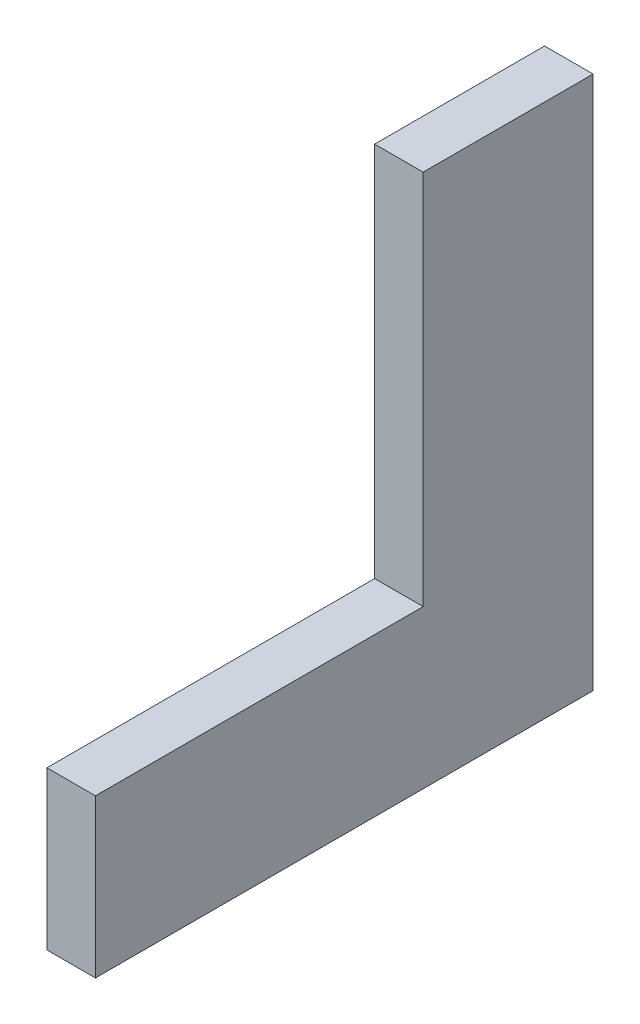
ISO-10303-21;
HEADER;
FILE_DESCRIPTION(('STEP AP214'),'2;1');
FILE_NAME('part.step','',(''),(''),'','','');
FILE_SCHEMA(('AUTOMOTIVE_DESIGN { 1 0 10303 214 1 1 1 1 }'));
ENDSEC;
DATA;
#1=APPLICATION_CONTEXT('core data for automotive mechanical design processes');
#2=APPLICATION_PROTOCOL_DEFINITION('international standard','automotive_design',2000,#1);
#3=PRODUCT_CONTEXT('',#1,'mechanical');
#4=PRODUCT('Part','Part','',(#3));
#5=PRODUCT_RELATED_PRODUCT_CATEGORY('part','',(#4));
#6=PRODUCT_DEFINITION_FORMATION('','',#4);
#7=PRODUCT_DEFINITION_CONTEXT('part definition',#1,'design');
#8=PRODUCT_DEFINITION('design','',#6,#7);
#9=PRODUCT_DEFINITION_SHAPE('','',#8);
#10=(LENGTH_UNIT() NAMED_UNIT(*) SI_UNIT(.MILLI.,.METRE.));
#11=(NAMED_UNIT(*) PLANE_ANGLE_UNIT() SI_UNIT($,.RADIAN.));
#12=(NAMED_UNIT(*) SI_UNIT($,.STERADIAN.) SOLID_ANGLE_UNIT());
#13=UNCERTAINTY_MEASURE_WITH_UNIT(LENGTH_MEASURE(1.E-05),#10,'distance_accuracy_value','');
#14=(GEOMETRIC_REPRESENTATION_CONTEXT(3) GLOBAL_UNCERTAINTY_ASSIGNED_CONTEXT((#13)) GLOBAL_UNIT_ASSIGNED_CONTEXT((#10,
#11,#12)) REPRESENTATION_CONTEXT('',''));
#15=CARTESIAN_POINT('',(0.,0.,0.));
#16=DIRECTION('',(0.,0.,1.));
#17=DIRECTION('',(1.,0.,0.));
#18=AXIS2_PLACEMENT_3D('',#15,#16,#17);
#19=CARTESIAN_POINT('',(1.42499934,-18.52500066,2.05));
#20=DIRECTION('',(-1.,0.,0.));
#21=DIRECTION('',(0.,0.,1.));
#22=AXIS2_PLACEMENT_3D('',#19,#20,#21);
#23=PLANE('',#22);
#24=DIRECTION('',(0.,0.,1.));
#25=VECTOR('',#24,1.);
#26=CARTESIAN_POINT('',(1.42499934,-16.32500066,2.05));
#27=LINE('',#26,#25);
#28=CARTESIAN_POINT('',(1.42499934,-16.32500066,0.7));
#29=VERTEX_POINT('',#28);
#30=CARTESIAN_POINT('',(1.42499934,-16.32500066,0.));
#31=VERTEX_POINT('',#30);
#32=EDGE_CURVE('E89',#29,#31,#27,.F.);
#33=ORIENTED_EDGE('',*,*,#32,.T.);
#34=DIRECTION('',(0.,1.,0.));
#35=VECTOR('',#34,1.);
#36=CARTESIAN_POINT('',(1.42499934,-18.52500066,0.));
#37=LINE('',#36,#35);
#38=CARTESIAN_POINT('',(1.42499934,-18.52500066,0.));
#39=VERTEX_POINT('',#38);
#40=EDGE_CURVE('E93',#39,#31,#37,.T.);
#41=ORIENTED_EDGE('',*,*,#40,.F.);
#42=DIRECTION('',(0.,0.,-1.));
#43=VECTOR('',#42,1.);
#44=CARTESIAN_POINT('',(1.42499934,-18.52500066,0.1));
#45=LINE('',#44,#43);
#46=CARTESIAN_POINT('',(1.42499934,-18.52500066,2.05));
#47=VERTEX_POINT('',#46);
#48=EDGE_CURVE('E72',#47,#39,#45,.T.);
#49=ORIENTED_EDGE('',*,*,#48,.F.);
#50=DIRECTION('',(0.,1.,0.));
#51=VECTOR('',#50,1.);
#52=CARTESIAN_POINT('',(1.42499934,-18.52500066,2.05));
#53=LINE('',#52,#51);
#54=CARTESIAN_POINT('',(1.42499934,-17.87500066,2.05));
#55=VERTEX_POINT('',#54);
#56=EDGE_CURVE('E20',#47,#55,#53,.T.);
#57=ORIENTED_EDGE('',*,*,#56,.T.);
#58=DIRECTION('',(0.,0.,1.));
#59=VECTOR('',#58,1.);
#60=CARTESIAN_POINT('',(1.42499934,-17.87500066,2.05));
#61=LINE('',#60,#59);
#62=CARTESIAN_POINT('',(1.42499934,-17.87500066,0.7));
#63=VERTEX_POINT('',#62);
#64=EDGE_CURVE('E67',#55,#63,#61,.F.);
#65=ORIENTED_EDGE('',*,*,#64,.T.);
#66=DIRECTION('',(0.,1.,0.));
#67=VECTOR('',#66,1.);
#68=CARTESIAN_POINT('',(1.42499934,-18.52500066,0.7));
#69=LINE('',#68,#67);
#70=EDGE_CURVE('E88',#63,#29,#69,.T.);
#71=ORIENTED_EDGE('',*,*,#70,.T.);
#72=EDGE_LOOP('',(#33,#41,#49,#57,#65,#71));
#73=FACE_BOUND('',#72,.T.);
#74=ADVANCED_FACE('F17',(#73),#23,.T.);
#75=CARTESIAN_POINT('',(1.42499934,-18.52500066,0.));
#76=DIRECTION('',(0.,0.,-1.));
#77=DIRECTION('',(-1.,0.,0.));
#78=AXIS2_PLACEMENT_3D('',#75,#76,#77);
#79=PLANE('',#78);
#80=ORIENTED_EDGE('',*,*,#40,.T.);
#81=DIRECTION('',(1.,0.,0.));
#82=VECTOR('',#81,1.);
#83=CARTESIAN_POINT('',(1.42499934,-16.32500066,0.));
#84=LINE('',#83,#82);
#85=CARTESIAN_POINT('',(1.62499934,-16.32500066,0.));
#86=VERTEX_POINT('',#85);
#87=EDGE_CURVE('E101',#86,#31,#84,.F.);
#88=ORIENTED_EDGE('',*,*,#87,.F.);
#89=DIRECTION('',(0.,1.,0.));
#90=VECTOR('',#89,1.);
#91=CARTESIAN_POINT('',(1.62499934,-18.52500066,0.));
#92=LINE('',#91,#90);
#93=CARTESIAN_POINT('',(1.62499934,-18.52500066,0.));
#94=VERTEX_POINT('',#93);
#95=EDGE_CURVE('E105',#86,#94,#92,.F.);
#96=ORIENTED_EDGE('',*,*,#95,.T.);
#97=DIRECTION('',(1.,0.,0.));
#98=VECTOR('',#97,1.);
#99=CARTESIAN_POINT('',(6.87499934,-18.52500066,0.));
#100=LINE('',#99,#98);
#101=EDGE_CURVE('E97',#39,#94,#100,.T.);
#102=ORIENTED_EDGE('',*,*,#101,.F.);
#103=EDGE_LOOP('',(#80,#88,#96,#102));
#104=FACE_BOUND('',#103,.T.);
#105=ADVANCED_FACE('F124',(#104),#79,.T.);
#106=CARTESIAN_POINT('',(6.87499934,-18.52500066,0.1));
#107=DIRECTION('',(0.,-1.,0.));
#108=DIRECTION('',(0.,0.,-1.));
#109=AXIS2_PLACEMENT_3D('',#106,#107,#108);
#110=PLANE('',#109);
#111=ORIENTED_EDGE('',*,*,#101,.T.);
#112=DIRECTION('',(0.,0.,1.));
#113=VECTOR('',#112,1.);
#114=CARTESIAN_POINT('',(1.62499934,-18.52500066,2.05));
#115=LINE('',#114,#113);
#116=CARTESIAN_POINT('',(1.62499934,-18.52500066,2.05));
#117=VERTEX_POINT('',#116);
#118=EDGE_CURVE('E108',#94,#117,#115,.T.);
#119=ORIENTED_EDGE('',*,*,#118,.T.);
#120=DIRECTION('',(1.,0.,0.));
#121=VECTOR('',#120,1.);
#122=CARTESIAN_POINT('',(1.42499934,-18.52500066,2.05));
#123=LINE('',#122,#121);
#124=EDGE_CURVE('E84',#47,#117,#123,.T.);
#125=ORIENTED_EDGE('',*,*,#124,.F.);
#126=ORIENTED_EDGE('',*,*,#48,.T.);
#127=EDGE_LOOP('',(#111,#119,#125,#126));
#128=FACE_BOUND('',#127,.T.);
#129=ADVANCED_FACE('F127',(#128),#110,.T.);
#130=CARTESIAN_POINT('',(1.42499934,-17.87500066,2.05));
#131=DIRECTION('',(0.,0.,1.));
#132=DIRECTION('',(0.,-1.,0.));
#133=AXIS2_PLACEMENT_3D('',#130,#131,#132);
#134=PLANE('',#133);
#135=ORIENTED_EDGE('',*,*,#56,.F.);
#136=ORIENTED_EDGE('',*,*,#124,.T.);
#137=DIRECTION('',(0.,1.,0.));
#138=VECTOR('',#137,1.);
#139=CARTESIAN_POINT('',(1.62499934,-18.52500066,2.05));
#140=LINE('',#139,#138);
#141=CARTESIAN_POINT('',(1.62499934,-17.87500066,2.05));
#142=VERTEX_POINT('',#141);
#143=EDGE_CURVE('E79',#117,#142,#140,.T.);
#144=ORIENTED_EDGE('',*,*,#143,.T.);
#145=DIRECTION('',(1.,0.,0.));
#146=VECTOR('',#145,1.);
#147=CARTESIAN_POINT('',(1.42499934,-17.87500066,2.05));
#148=LINE('',#147,#146);
#149=EDGE_CURVE('E76',#55,#142,#148,.T.);
#150=ORIENTED_EDGE('',*,*,#149,.F.);
#151=EDGE_LOOP('',(#135,#136,#144,#150));
#152=FACE_BOUND('',#151,.T.);
#153=ADVANCED_FACE('F77',(#152),#134,.T.);
#154=CARTESIAN_POINT('',(1.42499934,-17.87500066,0.7));
#155=DIRECTION('',(0.,1.,0.));
#156=DIRECTION('',(0.,0.,1.));
#157=AXIS2_PLACEMENT_3D('',#154,#155,#156);
#158=PLANE('',#157);
#159=ORIENTED_EDGE('',*,*,#64,.F.);
#160=ORIENTED_EDGE('',*,*,#149,.T.);
#161=DIRECTION('',(0.,0.,1.));
#162=VECTOR('',#161,1.);
#163=CARTESIAN_POINT('',(1.62499934,-17.87500066,2.05));
#164=LINE('',#163,#162);
#165=CARTESIAN_POINT('',(1.62499934,-17.87500066,0.7));
#166=VERTEX_POINT('',#165);
#167=EDGE_CURVE('E112',#142,#166,#164,.F.);
#168=ORIENTED_EDGE('',*,*,#167,.T.);
#169=DIRECTION('',(1.,0.,0.));
#170=VECTOR('',#169,1.);
#171=CARTESIAN_POINT('',(1.42499934,-17.87500066,0.7));
#172=LINE('',#171,#170);
#173=EDGE_CURVE('E83',#63,#166,#172,.T.);
#174=ORIENTED_EDGE('',*,*,#173,.F.);
#175=EDGE_LOOP('',(#159,#160,#168,#174));
#176=FACE_BOUND('',#175,.T.);
#177=ADVANCED_FACE('F86',(#176),#158,.T.);
#178=CARTESIAN_POINT('',(1.42499934,-16.32500066,0.7));
#179=DIRECTION('',(0.,0.,1.));
#180=DIRECTION('',(0.,-1.,0.));
#181=AXIS2_PLACEMENT_3D('',#178,#179,#180);
#182=PLANE('',#181);
#183=ORIENTED_EDGE('',*,*,#70,.F.);
#184=ORIENTED_EDGE('',*,*,#173,.T.);
#185=DIRECTION('',(0.,1.,0.));
#186=VECTOR('',#185,1.);
#187=CARTESIAN_POINT('',(1.62499934,-18.52500066,0.7));
#188=LINE('',#187,#186);
#189=CARTESIAN_POINT('',(1.62499934,-16.32500066,0.7));
#190=VERTEX_POINT('',#189);
#191=EDGE_CURVE('E26',#166,#190,#188,.T.);
#192=ORIENTED_EDGE('',*,*,#191,.T.);
#193=DIRECTION('',(1.,0.,0.));
#194=VECTOR('',#193,1.);
#195=CARTESIAN_POINT('',(1.42499934,-16.32500066,0.7));
#196=LINE('',#195,#194);
#197=EDGE_CURVE('E34',#29,#190,#196,.T.);
#198=ORIENTED_EDGE('',*,*,#197,.F.);
#199=EDGE_LOOP('',(#183,#184,#192,#198));
#200=FACE_BOUND('',#199,.T.);
#201=ADVANCED_FACE('F117',(#200),#182,.T.);
#202=CARTESIAN_POINT('',(1.42499934,-16.32500066,0.7));
#203=DIRECTION('',(0.,1.,0.));
#204=DIRECTION('',(0.,0.,1.));
#205=AXIS2_PLACEMENT_3D('',#202,#203,#204);
#206=PLANE('',#205);
#207=ORIENTED_EDGE('',*,*,#32,.F.);
#208=ORIENTED_EDGE('',*,*,#197,.T.);
#209=DIRECTION('',(0.,0.,1.));
#210=VECTOR('',#209,1.);
#211=CARTESIAN_POINT('',(1.62499934,-16.32500066,2.05));
#212=LINE('',#211,#210);
#213=EDGE_CURVE('E11',#190,#86,#212,.F.);
#214=ORIENTED_EDGE('',*,*,#213,.T.);
#215=ORIENTED_EDGE('',*,*,#87,.T.);
#216=EDGE_LOOP('',(#207,#208,#214,#215));
#217=FACE_BOUND('',#216,.T.);
#218=ADVANCED_FACE('F122',(#217),#206,.T.);
#219=CARTESIAN_POINT('',(1.62499934,-18.52500066,2.05));
#220=DIRECTION('',(-1.,0.,0.));
#221=DIRECTION('',(0.,0.,1.));
#222=AXIS2_PLACEMENT_3D('',#219,#220,#221);
#223=PLANE('',#222);
#224=ORIENTED_EDGE('',*,*,#191,.F.);
#225=ORIENTED_EDGE('',*,*,#167,.F.);
#226=ORIENTED_EDGE('',*,*,#143,.F.);
#227=ORIENTED_EDGE('',*,*,#118,.F.);
#228=ORIENTED_EDGE('',*,*,#95,.F.);
#229=ORIENTED_EDGE('',*,*,#213,.F.);
#230=EDGE_LOOP('',(#224,#225,#226,#227,#228,#229));
#231=FACE_BOUND('',#230,.T.);
#232=ADVANCED_FACE('F119',(#231),#223,.F.);
#233=CLOSED_SHELL('',(#74,#105,#129,#153,#177,#201,#218,#232));
#234=MANIFOLD_SOLID_BREP('B1',#233);
#235=ADVANCED_BREP_SHAPE_REPRESENTATION('',(#18,#234),#14);
#236=SHAPE_DEFINITION_REPRESENTATION(#9,#235);
ENDSEC;
END-ISO-10303-21;
